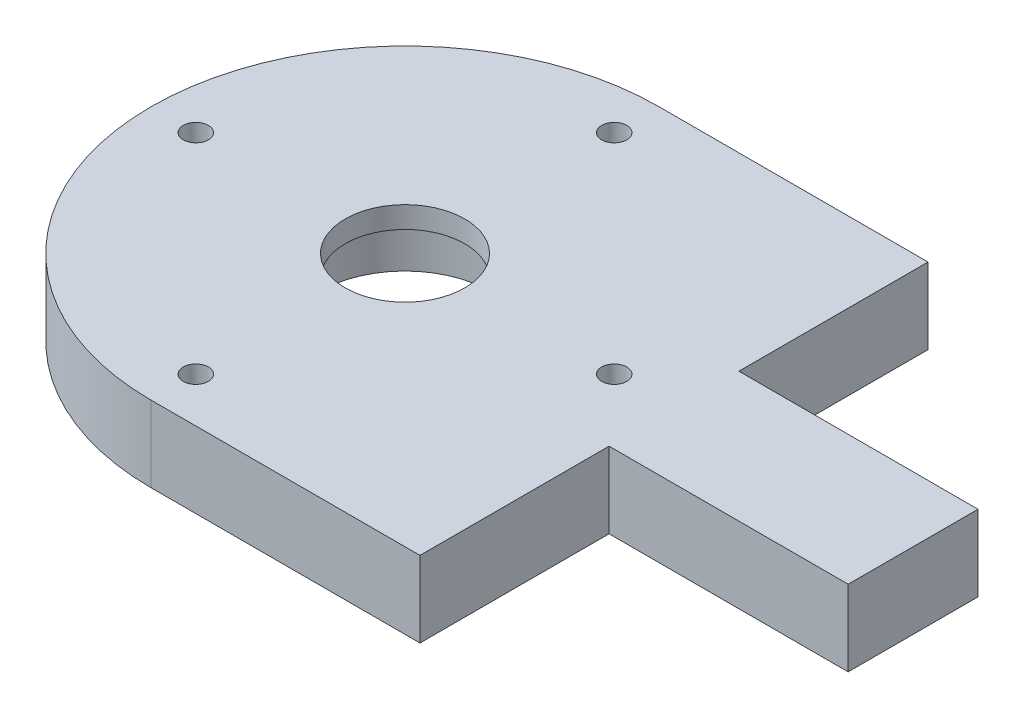
ISO-10303-21;
HEADER;
FILE_DESCRIPTION(('STEP AP214'),'2;1');
FILE_NAME('part.step','',(''),(''),'','','');
FILE_SCHEMA(('AUTOMOTIVE_DESIGN { 1 0 10303 214 1 1 1 1 }'));
ENDSEC;
DATA;
#1=APPLICATION_CONTEXT('core data for automotive mechanical design processes');
#2=APPLICATION_PROTOCOL_DEFINITION('international standard','automotive_design',2000,#1);
#3=PRODUCT_CONTEXT('',#1,'mechanical');
#4=PRODUCT('Part','Part','',(#3));
#5=PRODUCT_RELATED_PRODUCT_CATEGORY('part','',(#4));
#6=PRODUCT_DEFINITION_FORMATION('','',#4);
#7=PRODUCT_DEFINITION_CONTEXT('part definition',#1,'design');
#8=PRODUCT_DEFINITION('design','',#6,#7);
#9=PRODUCT_DEFINITION_SHAPE('','',#8);
#10=(LENGTH_UNIT() NAMED_UNIT(*) SI_UNIT(.MILLI.,.METRE.));
#11=(NAMED_UNIT(*) PLANE_ANGLE_UNIT() SI_UNIT($,.RADIAN.));
#12=(NAMED_UNIT(*) SI_UNIT($,.STERADIAN.) SOLID_ANGLE_UNIT());
#13=UNCERTAINTY_MEASURE_WITH_UNIT(LENGTH_MEASURE(1.E-05),#10,'distance_accuracy_value','');
#14=(GEOMETRIC_REPRESENTATION_CONTEXT(3) GLOBAL_UNCERTAINTY_ASSIGNED_CONTEXT((#13)) GLOBAL_UNIT_ASSIGNED_CONTEXT((#10,
#11,#12)) REPRESENTATION_CONTEXT('',''));
#15=CARTESIAN_POINT('',(0.,0.,0.));
#16=DIRECTION('',(0.,0.,1.));
#17=DIRECTION('',(1.,0.,0.));
#18=AXIS2_PLACEMENT_3D('',#15,#16,#17);
#19=CARTESIAN_POINT('',(0.,-12.7,0.));
#20=DIRECTION('',(0.,1.,0.));
#21=DIRECTION('',(0.,0.,1.));
#22=AXIS2_PLACEMENT_3D('',#19,#20,#21);
#23=PLANE('',#22);
#24=CARTESIAN_POINT('',(-137.9,-12.7,35.));
#25=DIRECTION('',(0.,1.,0.));
#26=DIRECTION('',(0.,0.,1.));
#27=AXIS2_PLACEMENT_3D('',#24,#25,#26);
#28=CIRCLE('',#27,4.05);
#29=CARTESIAN_POINT('',(-137.9,-12.7,30.95));
#30=VERTEX_POINT('',#29);
#31=CARTESIAN_POINT('',(-137.9,-12.7,39.05));
#32=VERTEX_POINT('',#31);
#33=EDGE_CURVE('E292',#30,#32,#28,.T.);
#34=ORIENTED_EDGE('',*,*,#33,.T.);
#35=DIRECTION('',(1.,0.,0.));
#36=VECTOR('',#35,1.);
#37=CARTESIAN_POINT('',(0.,-12.7,39.05));
#38=LINE('',#37,#36);
#39=CARTESIAN_POINT('',(-127.9,-12.7,39.05));
#40=VERTEX_POINT('',#39);
#41=EDGE_CURVE('E295',#32,#40,#38,.T.);
#42=ORIENTED_EDGE('',*,*,#41,.T.);
#43=CARTESIAN_POINT('',(-127.9,-12.7,35.));
#44=DIRECTION('',(0.,1.,0.));
#45=DIRECTION('',(0.,0.,1.));
#46=AXIS2_PLACEMENT_3D('',#43,#44,#45);
#47=CIRCLE('',#46,4.05);
#48=CARTESIAN_POINT('',(-127.9,-12.7,30.95));
#49=VERTEX_POINT('',#48);
#50=EDGE_CURVE('E299',#40,#49,#47,.T.);
#51=ORIENTED_EDGE('',*,*,#50,.T.);
#52=DIRECTION('',(-1.,0.,0.));
#53=VECTOR('',#52,1.);
#54=CARTESIAN_POINT('',(0.,-12.7,30.95));
#55=LINE('',#54,#53);
#56=EDGE_CURVE('E285',#49,#30,#55,.T.);
#57=ORIENTED_EDGE('',*,*,#56,.T.);
#58=EDGE_LOOP('',(#34,#42,#51,#57));
#59=FACE_BOUND('',#58,.T.);
#60=CARTESIAN_POINT('',(-137.9,-12.7,-35.));
#61=DIRECTION('',(0.,1.,0.));
#62=DIRECTION('',(0.,0.,1.));
#63=AXIS2_PLACEMENT_3D('',#60,#61,#62);
#64=CIRCLE('',#63,4.05);
#65=CARTESIAN_POINT('',(-137.9,-12.7,-39.05));
#66=VERTEX_POINT('',#65);
#67=CARTESIAN_POINT('',(-137.9,-12.7,-30.95));
#68=VERTEX_POINT('',#67);
#69=EDGE_CURVE('E251',#66,#68,#64,.T.);
#70=ORIENTED_EDGE('',*,*,#69,.T.);
#71=DIRECTION('',(1.,0.,0.));
#72=VECTOR('',#71,1.);
#73=CARTESIAN_POINT('',(0.,-12.7,-30.95));
#74=LINE('',#73,#72);
#75=CARTESIAN_POINT('',(-127.9,-12.7,-30.95));
#76=VERTEX_POINT('',#75);
#77=EDGE_CURVE('E356',#68,#76,#74,.T.);
#78=ORIENTED_EDGE('',*,*,#77,.T.);
#79=CARTESIAN_POINT('',(-127.9,-12.7,-35.));
#80=DIRECTION('',(0.,1.,0.));
#81=DIRECTION('',(0.,0.,1.));
#82=AXIS2_PLACEMENT_3D('',#79,#80,#81);
#83=CIRCLE('',#82,4.05);
#84=CARTESIAN_POINT('',(-127.9,-12.7,-39.05));
#85=VERTEX_POINT('',#84);
#86=EDGE_CURVE('E359',#76,#85,#83,.T.);
#87=ORIENTED_EDGE('',*,*,#86,.T.);
#88=DIRECTION('',(-1.,0.,0.));
#89=VECTOR('',#88,1.);
#90=CARTESIAN_POINT('',(0.,-12.7,-39.05));
#91=LINE('',#90,#89);
#92=EDGE_CURVE('E347',#85,#66,#91,.T.);
#93=ORIENTED_EDGE('',*,*,#92,.T.);
#94=EDGE_LOOP('',(#70,#78,#87,#93));
#95=FACE_BOUND('',#94,.T.);
#96=CARTESIAN_POINT('',(-137.9,-12.7,0.));
#97=DIRECTION('',(0.,1.,0.));
#98=DIRECTION('',(0.,0.,1.));
#99=AXIS2_PLACEMENT_3D('',#96,#97,#98);
#100=CIRCLE('',#99,14.35);
#101=CARTESIAN_POINT('',(-137.9,-12.7,14.35));
#102=VERTEX_POINT('',#101);
#103=EDGE_CURVE('E376',#102,#102,#100,.T.);
#104=ORIENTED_EDGE('',*,*,#103,.T.);
#105=EDGE_LOOP('',(#104));
#106=FACE_BOUND('',#105,.T.);
#107=DIRECTION('',(-1.,0.,0.));
#108=VECTOR('',#107,1.);
#109=CARTESIAN_POINT('',(0.,-12.7,10.8605569178145));
#110=LINE('',#109,#108);
#111=CARTESIAN_POINT('',(-52.9,-12.7,10.8605569178145));
#112=VERTEX_POINT('',#111);
#113=CARTESIAN_POINT('',(-92.9,-12.7,10.8605569178145));
#114=VERTEX_POINT('',#113);
#115=EDGE_CURVE('E243',#112,#114,#110,.T.);
#116=ORIENTED_EDGE('',*,*,#115,.T.);
#117=DIRECTION('',(0.,0.,1.));
#118=VECTOR('',#117,1.);
#119=CARTESIAN_POINT('',(-92.9,-12.7,0.));
#120=LINE('',#119,#118);
#121=CARTESIAN_POINT('',(-92.9,-12.7,42.5));
#122=VERTEX_POINT('',#121);
#123=EDGE_CURVE('E248',#114,#122,#120,.T.);
#124=ORIENTED_EDGE('',*,*,#123,.T.);
#125=DIRECTION('',(1.,0.,0.));
#126=VECTOR('',#125,1.);
#127=CARTESIAN_POINT('',(0.,-12.7,42.5));
#128=LINE('',#127,#126);
#129=CARTESIAN_POINT('',(-137.9,-12.7,42.5));
#130=VERTEX_POINT('',#129);
#131=EDGE_CURVE('E382',#130,#122,#128,.T.);
#132=ORIENTED_EDGE('',*,*,#131,.F.);
#133=CARTESIAN_POINT('',(-137.9,-12.7,0.));
#134=DIRECTION('',(0.,1.,0.));
#135=DIRECTION('',(0.,0.,1.));
#136=AXIS2_PLACEMENT_3D('',#133,#134,#135);
#137=CIRCLE('',#136,42.5);
#138=CARTESIAN_POINT('',(-137.9,-12.7,-42.5));
#139=VERTEX_POINT('',#138);
#140=EDGE_CURVE('E379',#139,#130,#137,.T.);
#141=ORIENTED_EDGE('',*,*,#140,.F.);
#142=DIRECTION('',(1.,0.,0.));
#143=VECTOR('',#142,1.);
#144=CARTESIAN_POINT('',(0.,-12.7,-42.5));
#145=LINE('',#144,#143);
#146=CARTESIAN_POINT('',(-92.9,-12.7,-42.5));
#147=VERTEX_POINT('',#146);
#148=EDGE_CURVE('E386',#139,#147,#145,.T.);
#149=ORIENTED_EDGE('',*,*,#148,.T.);
#150=DIRECTION('',(0.,0.,1.));
#151=VECTOR('',#150,1.);
#152=CARTESIAN_POINT('',(-92.9,-12.7,0.));
#153=LINE('',#152,#151);
#154=CARTESIAN_POINT('',(-92.9,-12.7,-10.8605569178145));
#155=VERTEX_POINT('',#154);
#156=EDGE_CURVE('E237',#147,#155,#153,.T.);
#157=ORIENTED_EDGE('',*,*,#156,.T.);
#158=DIRECTION('',(1.,0.,0.));
#159=VECTOR('',#158,1.);
#160=CARTESIAN_POINT('',(0.,-12.7,-10.8605569178145));
#161=LINE('',#160,#159);
#162=CARTESIAN_POINT('',(-52.9,-12.7,-10.8605569178145));
#163=VERTEX_POINT('',#162);
#164=EDGE_CURVE('E207',#155,#163,#161,.T.);
#165=ORIENTED_EDGE('',*,*,#164,.T.);
#166=DIRECTION('',(0.,0.,1.));
#167=VECTOR('',#166,1.);
#168=CARTESIAN_POINT('',(-52.9,-12.7,0.));
#169=LINE('',#168,#167);
#170=EDGE_CURVE('E240',#163,#112,#169,.T.);
#171=ORIENTED_EDGE('',*,*,#170,.T.);
#172=EDGE_LOOP('',(#116,#124,#132,#141,#149,#157,#165,#171));
#173=FACE_BOUND('',#172,.T.);
#174=CARTESIAN_POINT('',(-92.9,-12.7,0.));
#175=DIRECTION('',(0.,1.,0.));
#176=DIRECTION('',(0.,0.,1.));
#177=AXIS2_PLACEMENT_3D('',#174,#175,#176);
#178=CIRCLE('',#177,4.05);
#179=CARTESIAN_POINT('',(-92.9,-12.7,4.05));
#180=VERTEX_POINT('',#179);
#181=CARTESIAN_POINT('',(-92.9,-12.7,-4.05));
#182=VERTEX_POINT('',#181);
#183=EDGE_CURVE('E323',#180,#182,#178,.T.);
#184=ORIENTED_EDGE('',*,*,#183,.T.);
#185=DIRECTION('',(-1.,0.,0.));
#186=VECTOR('',#185,1.);
#187=CARTESIAN_POINT('',(0.,-12.7,-4.05));
#188=LINE('',#187,#186);
#189=CARTESIAN_POINT('',(-102.9,-12.7,-4.05));
#190=VERTEX_POINT('',#189);
#191=EDGE_CURVE('E326',#182,#190,#188,.T.);
#192=ORIENTED_EDGE('',*,*,#191,.T.);
#193=CARTESIAN_POINT('',(-102.9,-12.7,0.));
#194=DIRECTION('',(0.,1.,0.));
#195=DIRECTION('',(0.,0.,1.));
#196=AXIS2_PLACEMENT_3D('',#193,#194,#195);
#197=CIRCLE('',#196,4.05);
#198=CARTESIAN_POINT('',(-102.9,-12.7,4.05));
#199=VERTEX_POINT('',#198);
#200=EDGE_CURVE('E330',#190,#199,#197,.T.);
#201=ORIENTED_EDGE('',*,*,#200,.T.);
#202=DIRECTION('',(1.,0.,0.));
#203=VECTOR('',#202,1.);
#204=CARTESIAN_POINT('',(0.,-12.7,4.04999999999998));
#205=LINE('',#204,#203);
#206=EDGE_CURVE('E316',#199,#180,#205,.T.);
#207=ORIENTED_EDGE('',*,*,#206,.T.);
#208=EDGE_LOOP('',(#184,#192,#201,#207));
#209=FACE_BOUND('',#208,.T.);
#210=CARTESIAN_POINT('',(-162.9,-12.7,0.));
#211=DIRECTION('',(0.,1.,0.));
#212=DIRECTION('',(0.,0.,1.));
#213=AXIS2_PLACEMENT_3D('',#210,#211,#212);
#214=CIRCLE('',#213,4.05000000000001);
#215=CARTESIAN_POINT('',(-162.9,-12.7,4.05000000000001));
#216=VERTEX_POINT('',#215);
#217=CARTESIAN_POINT('',(-162.9,-12.7,-4.05000000000001));
#218=VERTEX_POINT('',#217);
#219=EDGE_CURVE('E60',#216,#218,#214,.T.);
#220=ORIENTED_EDGE('',*,*,#219,.T.);
#221=DIRECTION('',(-1.,0.,0.));
#222=VECTOR('',#221,1.);
#223=CARTESIAN_POINT('',(0.,-12.7,-4.05000000000002));
#224=LINE('',#223,#222);
#225=CARTESIAN_POINT('',(-172.9,-12.7,-4.05000000000001));
#226=VERTEX_POINT('',#225);
#227=EDGE_CURVE('E264',#218,#226,#224,.T.);
#228=ORIENTED_EDGE('',*,*,#227,.T.);
#229=CARTESIAN_POINT('',(-172.9,-12.7,0.));
#230=DIRECTION('',(0.,1.,0.));
#231=DIRECTION('',(0.,0.,1.));
#232=AXIS2_PLACEMENT_3D('',#229,#230,#231);
#233=CIRCLE('',#232,4.05000000000001);
#234=CARTESIAN_POINT('',(-172.9,-12.7,4.05000000000001));
#235=VERTEX_POINT('',#234);
#236=EDGE_CURVE('E268',#226,#235,#233,.T.);
#237=ORIENTED_EDGE('',*,*,#236,.T.);
#238=DIRECTION('',(1.,0.,0.));
#239=VECTOR('',#238,1.);
#240=CARTESIAN_POINT('',(0.,-12.7,4.05000000000002));
#241=LINE('',#240,#239);
#242=EDGE_CURVE('E256',#235,#216,#241,.T.);
#243=ORIENTED_EDGE('',*,*,#242,.T.);
#244=EDGE_LOOP('',(#220,#228,#237,#243));
#245=FACE_BOUND('',#244,.T.);
#246=ADVANCED_FACE('F35',(#59,#95,#106,#173,#209,#245),#23,.F.);
#247=CARTESIAN_POINT('',(-137.9,-12.7,0.));
#248=DIRECTION('',(0.,1.,0.));
#249=DIRECTION('',(0.,0.,1.));
#250=AXIS2_PLACEMENT_3D('',#247,#248,#249);
#251=CYLINDRICAL_SURFACE('',#250,42.5);
#252=CARTESIAN_POINT('',(-137.9,0.,0.));
#253=DIRECTION('',(0.,1.,0.));
#254=DIRECTION('',(0.,0.,1.));
#255=AXIS2_PLACEMENT_3D('',#252,#253,#254);
#256=CIRCLE('',#255,42.5);
#257=CARTESIAN_POINT('',(-137.9,0.,-42.5));
#258=VERTEX_POINT('',#257);
#259=CARTESIAN_POINT('',(-137.9,0.,42.5));
#260=VERTEX_POINT('',#259);
#261=EDGE_CURVE('E404',#258,#260,#256,.T.);
#262=ORIENTED_EDGE('',*,*,#261,.F.);
#263=DIRECTION('',(0.,1.,0.));
#264=VECTOR('',#263,1.);
#265=CARTESIAN_POINT('',(-137.9,-12.7,-42.5));
#266=LINE('',#265,#264);
#267=EDGE_CURVE('E11',#139,#258,#266,.T.);
#268=ORIENTED_EDGE('',*,*,#267,.F.);
#269=ORIENTED_EDGE('',*,*,#140,.T.);
#270=DIRECTION('',(0.,1.,0.));
#271=VECTOR('',#270,1.);
#272=CARTESIAN_POINT('',(-137.9,-12.7,42.5));
#273=LINE('',#272,#271);
#274=EDGE_CURVE('E44',#130,#260,#273,.T.);
#275=ORIENTED_EDGE('',*,*,#274,.T.);
#276=EDGE_LOOP('',(#262,#268,#269,#275));
#277=FACE_BOUND('',#276,.T.);
#278=ADVANCED_FACE('F447',(#277),#251,.T.);
#279=CARTESIAN_POINT('',(0.,-12.7,-42.5));
#280=DIRECTION('',(0.,0.,1.));
#281=DIRECTION('',(1.,0.,0.));
#282=AXIS2_PLACEMENT_3D('',#279,#280,#281);
#283=PLANE('',#282);
#284=DIRECTION('',(1.,0.,0.));
#285=VECTOR('',#284,1.);
#286=CARTESIAN_POINT('',(0.,0.,-42.5));
#287=LINE('',#286,#285);
#288=CARTESIAN_POINT('',(-92.9,0.,-42.5));
#289=VERTEX_POINT('',#288);
#290=EDGE_CURVE('E383',#258,#289,#287,.T.);
#291=ORIENTED_EDGE('',*,*,#290,.T.);
#292=DIRECTION('',(0.,-1.,0.));
#293=VECTOR('',#292,1.);
#294=CARTESIAN_POINT('',(-92.9,-12.7,-42.5));
#295=LINE('',#294,#293);
#296=EDGE_CURVE('E52',#289,#147,#295,.T.);
#297=ORIENTED_EDGE('',*,*,#296,.T.);
#298=ORIENTED_EDGE('',*,*,#148,.F.);
#299=ORIENTED_EDGE('',*,*,#267,.T.);
#300=EDGE_LOOP('',(#291,#297,#298,#299));
#301=FACE_BOUND('',#300,.T.);
#302=ADVANCED_FACE('F453',(#301),#283,.F.);
#303=CARTESIAN_POINT('',(0.,-12.7,42.5));
#304=DIRECTION('',(0.,0.,1.));
#305=DIRECTION('',(1.,0.,0.));
#306=AXIS2_PLACEMENT_3D('',#303,#304,#305);
#307=PLANE('',#306);
#308=DIRECTION('',(0.,-1.,0.));
#309=VECTOR('',#308,1.);
#310=CARTESIAN_POINT('',(-92.9,-12.7,42.5));
#311=LINE('',#310,#309);
#312=CARTESIAN_POINT('',(-92.9,0.,42.5));
#313=VERTEX_POINT('',#312);
#314=EDGE_CURVE('E246',#313,#122,#311,.T.);
#315=ORIENTED_EDGE('',*,*,#314,.F.);
#316=DIRECTION('',(1.,0.,0.));
#317=VECTOR('',#316,1.);
#318=CARTESIAN_POINT('',(0.,0.,42.5));
#319=LINE('',#318,#317);
#320=EDGE_CURVE('E407',#260,#313,#319,.T.);
#321=ORIENTED_EDGE('',*,*,#320,.F.);
#322=ORIENTED_EDGE('',*,*,#274,.F.);
#323=ORIENTED_EDGE('',*,*,#131,.T.);
#324=EDGE_LOOP('',(#315,#321,#322,#323));
#325=FACE_BOUND('',#324,.T.);
#326=ADVANCED_FACE('F466',(#325),#307,.T.);
#327=CARTESIAN_POINT('',(-137.9,-12.7,0.));
#328=DIRECTION('',(0.,1.,0.));
#329=DIRECTION('',(0.,0.,1.));
#330=AXIS2_PLACEMENT_3D('',#327,#328,#329);
#331=CYLINDRICAL_SURFACE('',#330,9.99999999999998);
#332=CARTESIAN_POINT('',(-137.9,-3.6,0.));
#333=DIRECTION('',(0.,1.,0.));
#334=DIRECTION('',(0.,0.,1.));
#335=AXIS2_PLACEMENT_3D('',#332,#333,#334);
#336=CIRCLE('',#335,9.99999999999998);
#337=CARTESIAN_POINT('',(-137.9,-3.6,9.99999999999998));
#338=VERTEX_POINT('',#337);
#339=EDGE_CURVE('E375',#338,#338,#336,.F.);
#340=ORIENTED_EDGE('',*,*,#339,.T.);
#341=EDGE_LOOP('',(#340));
#342=FACE_BOUND('',#341,.T.);
#343=CARTESIAN_POINT('',(-137.9,0.,0.));
#344=DIRECTION('',(0.,1.,0.));
#345=DIRECTION('',(0.,0.,1.));
#346=AXIS2_PLACEMENT_3D('',#343,#344,#345);
#347=CIRCLE('',#346,9.99999999999998);
#348=CARTESIAN_POINT('',(-137.9,0.,9.99999999999998));
#349=VERTEX_POINT('',#348);
#350=EDGE_CURVE('E401',#349,#349,#347,.T.);
#351=ORIENTED_EDGE('',*,*,#350,.T.);
#352=EDGE_LOOP('',(#351));
#353=FACE_BOUND('',#352,.T.);
#354=ADVANCED_FACE('F469',(#342,#353),#331,.F.);
#355=CARTESIAN_POINT('',(-172.9,-12.7,0.));
#356=DIRECTION('',(0.,1.,0.));
#357=DIRECTION('',(0.,0.,1.));
#358=AXIS2_PLACEMENT_3D('',#355,#356,#357);
#359=CYLINDRICAL_SURFACE('',#358,2.09999999999999);
#360=CARTESIAN_POINT('',(-172.9,-7.7,0.));
#361=DIRECTION('',(0.,1.,0.));
#362=DIRECTION('',(0.,0.,1.));
#363=AXIS2_PLACEMENT_3D('',#360,#361,#362);
#364=CIRCLE('',#363,2.09999999999999);
#365=CARTESIAN_POINT('',(-172.9,-7.7,2.09999999999999));
#366=VERTEX_POINT('',#365);
#367=EDGE_CURVE('E39',#366,#366,#364,.F.);
#368=ORIENTED_EDGE('',*,*,#367,.T.);
#369=EDGE_LOOP('',(#368));
#370=FACE_BOUND('',#369,.T.);
#371=CARTESIAN_POINT('',(-172.9,0.,0.));
#372=DIRECTION('',(0.,1.,0.));
#373=DIRECTION('',(0.,0.,1.));
#374=AXIS2_PLACEMENT_3D('',#371,#372,#373);
#375=CIRCLE('',#374,2.09999999999999);
#376=CARTESIAN_POINT('',(-172.9,0.,2.09999999999999));
#377=VERTEX_POINT('',#376);
#378=EDGE_CURVE('E398',#377,#377,#375,.T.);
#379=ORIENTED_EDGE('',*,*,#378,.T.);
#380=EDGE_LOOP('',(#379));
#381=FACE_BOUND('',#380,.T.);
#382=ADVANCED_FACE('F425',(#370,#381),#359,.F.);
#383=CARTESIAN_POINT('',(-137.9,-12.7,-35.));
#384=DIRECTION('',(0.,1.,0.));
#385=DIRECTION('',(0.,0.,1.));
#386=AXIS2_PLACEMENT_3D('',#383,#384,#385);
#387=CYLINDRICAL_SURFACE('',#386,2.10000000000002);
#388=CARTESIAN_POINT('',(-137.9,-7.7,-35.));
#389=DIRECTION('',(0.,1.,0.));
#390=DIRECTION('',(0.,0.,1.));
#391=AXIS2_PLACEMENT_3D('',#388,#389,#390);
#392=CIRCLE('',#391,2.10000000000002);
#393=CARTESIAN_POINT('',(-137.9,-7.7,-32.9));
#394=VERTEX_POINT('',#393);
#395=EDGE_CURVE('E418',#394,#394,#392,.F.);
#396=ORIENTED_EDGE('',*,*,#395,.T.);
#397=EDGE_LOOP('',(#396));
#398=FACE_BOUND('',#397,.T.);
#399=CARTESIAN_POINT('',(-137.9,0.,-35.));
#400=DIRECTION('',(0.,1.,0.));
#401=DIRECTION('',(0.,0.,1.));
#402=AXIS2_PLACEMENT_3D('',#399,#400,#401);
#403=CIRCLE('',#402,2.10000000000002);
#404=CARTESIAN_POINT('',(-137.9,0.,-32.9));
#405=VERTEX_POINT('',#404);
#406=EDGE_CURVE('E395',#405,#405,#403,.T.);
#407=ORIENTED_EDGE('',*,*,#406,.T.);
#408=EDGE_LOOP('',(#407));
#409=FACE_BOUND('',#408,.T.);
#410=ADVANCED_FACE('F477',(#398,#409),#387,.F.);
#411=CARTESIAN_POINT('',(-102.9,-12.7,0.));
#412=DIRECTION('',(0.,1.,0.));
#413=DIRECTION('',(0.,0.,1.));
#414=AXIS2_PLACEMENT_3D('',#411,#412,#413);
#415=CYLINDRICAL_SURFACE('',#414,2.1);
#416=CARTESIAN_POINT('',(-102.9,-7.7,0.));
#417=DIRECTION('',(0.,1.,0.));
#418=DIRECTION('',(0.,0.,1.));
#419=AXIS2_PLACEMENT_3D('',#416,#417,#418);
#420=CIRCLE('',#419,2.1);
#421=CARTESIAN_POINT('',(-102.9,-7.7,2.1));
#422=VERTEX_POINT('',#421);
#423=EDGE_CURVE('E416',#422,#422,#420,.F.);
#424=ORIENTED_EDGE('',*,*,#423,.T.);
#425=EDGE_LOOP('',(#424));
#426=FACE_BOUND('',#425,.T.);
#427=CARTESIAN_POINT('',(-102.9,0.,0.));
#428=DIRECTION('',(0.,1.,0.));
#429=DIRECTION('',(0.,0.,1.));
#430=AXIS2_PLACEMENT_3D('',#427,#428,#429);
#431=CIRCLE('',#430,2.1);
#432=CARTESIAN_POINT('',(-102.9,0.,2.1));
#433=VERTEX_POINT('',#432);
#434=EDGE_CURVE('E392',#433,#433,#431,.T.);
#435=ORIENTED_EDGE('',*,*,#434,.T.);
#436=EDGE_LOOP('',(#435));
#437=FACE_BOUND('',#436,.T.);
#438=ADVANCED_FACE('F479',(#426,#437),#415,.F.);
#439=CARTESIAN_POINT('',(-137.9,-12.7,35.));
#440=DIRECTION('',(0.,1.,0.));
#441=DIRECTION('',(0.,0.,1.));
#442=AXIS2_PLACEMENT_3D('',#439,#440,#441);
#443=CYLINDRICAL_SURFACE('',#442,2.10000000000002);
#444=CARTESIAN_POINT('',(-137.9,-7.7,35.));
#445=DIRECTION('',(0.,1.,0.));
#446=DIRECTION('',(0.,0.,1.));
#447=AXIS2_PLACEMENT_3D('',#444,#445,#446);
#448=CIRCLE('',#447,2.10000000000002);
#449=CARTESIAN_POINT('',(-137.9,-7.7,37.1));
#450=VERTEX_POINT('',#449);
#451=EDGE_CURVE('E280',#450,#450,#448,.F.);
#452=ORIENTED_EDGE('',*,*,#451,.T.);
#453=EDGE_LOOP('',(#452));
#454=FACE_BOUND('',#453,.T.);
#455=CARTESIAN_POINT('',(-137.9,0.,35.));
#456=DIRECTION('',(0.,1.,0.));
#457=DIRECTION('',(0.,0.,1.));
#458=AXIS2_PLACEMENT_3D('',#455,#456,#457);
#459=CIRCLE('',#458,2.10000000000002);
#460=CARTESIAN_POINT('',(-137.9,0.,37.1));
#461=VERTEX_POINT('',#460);
#462=EDGE_CURVE('E389',#461,#461,#459,.T.);
#463=ORIENTED_EDGE('',*,*,#462,.T.);
#464=EDGE_LOOP('',(#463));
#465=FACE_BOUND('',#464,.T.);
#466=ADVANCED_FACE('F37',(#454,#465),#443,.F.);
#467=CARTESIAN_POINT('',(0.,0.,0.));
#468=DIRECTION('',(0.,1.,0.));
#469=DIRECTION('',(0.,0.,1.));
#470=AXIS2_PLACEMENT_3D('',#467,#468,#469);
#471=PLANE('',#470);
#472=DIRECTION('',(0.,0.,1.));
#473=VECTOR('',#472,1.);
#474=CARTESIAN_POINT('',(-92.9,0.,10.8605569178145));
#475=LINE('',#474,#473);
#476=CARTESIAN_POINT('',(-92.9,0.,10.8605569178145));
#477=VERTEX_POINT('',#476);
#478=EDGE_CURVE('E210',#477,#313,#475,.T.);
#479=ORIENTED_EDGE('',*,*,#478,.F.);
#480=DIRECTION('',(-1.,0.,0.));
#481=VECTOR('',#480,1.);
#482=CARTESIAN_POINT('',(-52.9,0.,10.8605569178145));
#483=LINE('',#482,#481);
#484=CARTESIAN_POINT('',(-52.9,0.,10.8605569178145));
#485=VERTEX_POINT('',#484);
#486=EDGE_CURVE('E225',#485,#477,#483,.T.);
#487=ORIENTED_EDGE('',*,*,#486,.F.);
#488=DIRECTION('',(0.,0.,1.));
#489=VECTOR('',#488,1.);
#490=CARTESIAN_POINT('',(-52.9,0.,-10.8605569178145));
#491=LINE('',#490,#489);
#492=CARTESIAN_POINT('',(-52.9,0.,-10.8605569178145));
#493=VERTEX_POINT('',#492);
#494=EDGE_CURVE('E223',#493,#485,#491,.T.);
#495=ORIENTED_EDGE('',*,*,#494,.F.);
#496=DIRECTION('',(1.,0.,0.));
#497=VECTOR('',#496,1.);
#498=CARTESIAN_POINT('',(-92.9,0.,-10.8605569178145));
#499=LINE('',#498,#497);
#500=CARTESIAN_POINT('',(-92.9,0.,-10.8605569178145));
#501=VERTEX_POINT('',#500);
#502=EDGE_CURVE('E204',#501,#493,#499,.T.);
#503=ORIENTED_EDGE('',*,*,#502,.F.);
#504=DIRECTION('',(0.,0.,1.));
#505=VECTOR('',#504,1.);
#506=CARTESIAN_POINT('',(-92.9,0.,-58.1666365694492));
#507=LINE('',#506,#505);
#508=EDGE_CURVE('E212',#289,#501,#507,.T.);
#509=ORIENTED_EDGE('',*,*,#508,.F.);
#510=ORIENTED_EDGE('',*,*,#290,.F.);
#511=ORIENTED_EDGE('',*,*,#261,.T.);
#512=ORIENTED_EDGE('',*,*,#320,.T.);
#513=EDGE_LOOP('',(#479,#487,#495,#503,#509,#510,#511,#512));
#514=FACE_BOUND('',#513,.T.);
#515=ORIENTED_EDGE('',*,*,#462,.F.);
#516=EDGE_LOOP('',(#515));
#517=FACE_BOUND('',#516,.T.);
#518=ORIENTED_EDGE('',*,*,#434,.F.);
#519=EDGE_LOOP('',(#518));
#520=FACE_BOUND('',#519,.T.);
#521=ORIENTED_EDGE('',*,*,#406,.F.);
#522=EDGE_LOOP('',(#521));
#523=FACE_BOUND('',#522,.T.);
#524=ORIENTED_EDGE('',*,*,#378,.F.);
#525=EDGE_LOOP('',(#524));
#526=FACE_BOUND('',#525,.T.);
#527=ORIENTED_EDGE('',*,*,#350,.F.);
#528=EDGE_LOOP('',(#527));
#529=FACE_BOUND('',#528,.T.);
#530=ADVANCED_FACE('F219',(#514,#517,#520,#523,#526,#529),#471,.T.);
#531=CARTESIAN_POINT('',(-137.9,-3.6,0.));
#532=DIRECTION('',(0.,1.,0.));
#533=DIRECTION('',(0.,0.,1.));
#534=AXIS2_PLACEMENT_3D('',#531,#532,#533);
#535=PLANE('',#534);
#536=CARTESIAN_POINT('',(-137.9,-3.6,0.));
#537=DIRECTION('',(0.,1.,0.));
#538=DIRECTION('',(0.,0.,1.));
#539=AXIS2_PLACEMENT_3D('',#536,#537,#538);
#540=CIRCLE('',#539,14.35);
#541=CARTESIAN_POINT('',(-137.9,-3.6,14.35));
#542=VERTEX_POINT('',#541);
#543=EDGE_CURVE('E372',#542,#542,#540,.T.);
#544=ORIENTED_EDGE('',*,*,#543,.F.);
#545=EDGE_LOOP('',(#544));
#546=FACE_BOUND('',#545,.T.);
#547=ORIENTED_EDGE('',*,*,#339,.F.);
#548=EDGE_LOOP('',(#547));
#549=FACE_BOUND('',#548,.T.);
#550=ADVANCED_FACE('F463',(#546,#549),#535,.F.);
#551=CARTESIAN_POINT('',(-137.9,-3.6,0.));
#552=DIRECTION('',(0.,-1.,0.));
#553=DIRECTION('',(0.,0.,-1.));
#554=AXIS2_PLACEMENT_3D('',#551,#552,#553);
#555=CYLINDRICAL_SURFACE('',#554,14.35);
#556=ORIENTED_EDGE('',*,*,#543,.T.);
#557=EDGE_LOOP('',(#556));
#558=FACE_BOUND('',#557,.T.);
#559=ORIENTED_EDGE('',*,*,#103,.F.);
#560=EDGE_LOOP('',(#559));
#561=FACE_BOUND('',#560,.T.);
#562=ADVANCED_FACE('F459',(#558,#561),#555,.F.);
#563=CARTESIAN_POINT('',(-137.9,-7.7,-35.));
#564=DIRECTION('',(0.,1.,0.));
#565=DIRECTION('',(0.,0.,1.));
#566=AXIS2_PLACEMENT_3D('',#563,#564,#565);
#567=PLANE('',#566);
#568=CARTESIAN_POINT('',(-137.9,-7.7,-35.));
#569=DIRECTION('',(0.,1.,0.));
#570=DIRECTION('',(0.,0.,1.));
#571=AXIS2_PLACEMENT_3D('',#568,#569,#570);
#572=CIRCLE('',#571,4.05);
#573=CARTESIAN_POINT('',(-137.9,-7.7,-39.05));
#574=VERTEX_POINT('',#573);
#575=CARTESIAN_POINT('',(-137.9,-7.7,-30.95));
#576=VERTEX_POINT('',#575);
#577=EDGE_CURVE('E343',#574,#576,#572,.T.);
#578=ORIENTED_EDGE('',*,*,#577,.F.);
#579=DIRECTION('',(-1.,0.,0.));
#580=VECTOR('',#579,1.);
#581=CARTESIAN_POINT('',(0.,-7.7,-39.05));
#582=LINE('',#581,#580);
#583=CARTESIAN_POINT('',(-127.9,-7.7,-39.05));
#584=VERTEX_POINT('',#583);
#585=EDGE_CURVE('E351',#584,#574,#582,.T.);
#586=ORIENTED_EDGE('',*,*,#585,.F.);
#587=CARTESIAN_POINT('',(-127.9,-7.7,-35.));
#588=DIRECTION('',(0.,1.,0.));
#589=DIRECTION('',(0.,0.,1.));
#590=AXIS2_PLACEMENT_3D('',#587,#588,#589);
#591=CIRCLE('',#590,4.05);
#592=CARTESIAN_POINT('',(-127.9,-7.7,-30.95));
#593=VERTEX_POINT('',#592);
#594=EDGE_CURVE('E349',#593,#584,#591,.T.);
#595=ORIENTED_EDGE('',*,*,#594,.F.);
#596=DIRECTION('',(1.,0.,0.));
#597=VECTOR('',#596,1.);
#598=CARTESIAN_POINT('',(0.,-7.7,-30.95));
#599=LINE('',#598,#597);
#600=EDGE_CURVE('E346',#576,#593,#599,.T.);
#601=ORIENTED_EDGE('',*,*,#600,.F.);
#602=EDGE_LOOP('',(#578,#586,#595,#601));
#603=FACE_BOUND('',#602,.T.);
#604=ORIENTED_EDGE('',*,*,#395,.F.);
#605=EDGE_LOOP('',(#604));
#606=FACE_BOUND('',#605,.T.);
#607=ADVANCED_FACE('F532',(#603,#606),#567,.F.);
#608=CARTESIAN_POINT('',(-137.9,-7.7,-35.));
#609=DIRECTION('',(0.,-1.,0.));
#610=DIRECTION('',(0.,0.,-1.));
#611=AXIS2_PLACEMENT_3D('',#608,#609,#610);
#612=CYLINDRICAL_SURFACE('',#611,4.05);
#613=ORIENTED_EDGE('',*,*,#69,.F.);
#614=DIRECTION('',(0.,-1.,0.));
#615=VECTOR('',#614,1.);
#616=CARTESIAN_POINT('',(-137.9,-7.7,-39.05));
#617=LINE('',#616,#615);
#618=EDGE_CURVE('E353',#574,#66,#617,.T.);
#619=ORIENTED_EDGE('',*,*,#618,.F.);
#620=ORIENTED_EDGE('',*,*,#577,.T.);
#621=DIRECTION('',(0.,-1.,0.));
#622=VECTOR('',#621,1.);
#623=CARTESIAN_POINT('',(-137.9,-7.7,-30.95));
#624=LINE('',#623,#622);
#625=EDGE_CURVE('E327',#576,#68,#624,.T.);
#626=ORIENTED_EDGE('',*,*,#625,.T.);
#627=EDGE_LOOP('',(#613,#619,#620,#626));
#628=FACE_BOUND('',#627,.T.);
#629=ADVANCED_FACE('F534',(#628),#612,.F.);
#630=CARTESIAN_POINT('',(0.,-7.7,-30.95));
#631=DIRECTION('',(0.,0.,-1.));
#632=DIRECTION('',(-1.,0.,0.));
#633=AXIS2_PLACEMENT_3D('',#630,#631,#632);
#634=PLANE('',#633);
#635=ORIENTED_EDGE('',*,*,#77,.F.);
#636=ORIENTED_EDGE('',*,*,#625,.F.);
#637=ORIENTED_EDGE('',*,*,#600,.T.);
#638=DIRECTION('',(0.,-1.,0.));
#639=VECTOR('',#638,1.);
#640=CARTESIAN_POINT('',(-127.9,-7.7,-30.95));
#641=LINE('',#640,#639);
#642=EDGE_CURVE('E368',#593,#76,#641,.T.);
#643=ORIENTED_EDGE('',*,*,#642,.T.);
#644=EDGE_LOOP('',(#635,#636,#637,#643));
#645=FACE_BOUND('',#644,.T.);
#646=ADVANCED_FACE('F539',(#645),#634,.T.);
#647=CARTESIAN_POINT('',(-127.9,-7.7,-35.));
#648=DIRECTION('',(0.,-1.,0.));
#649=DIRECTION('',(0.,0.,-1.));
#650=AXIS2_PLACEMENT_3D('',#647,#648,#649);
#651=CYLINDRICAL_SURFACE('',#650,4.05);
#652=ORIENTED_EDGE('',*,*,#86,.F.);
#653=ORIENTED_EDGE('',*,*,#642,.F.);
#654=ORIENTED_EDGE('',*,*,#594,.T.);
#655=DIRECTION('',(0.,-1.,0.));
#656=VECTOR('',#655,1.);
#657=CARTESIAN_POINT('',(-127.9,-7.7,-39.05));
#658=LINE('',#657,#656);
#659=EDGE_CURVE('E366',#584,#85,#658,.T.);
#660=ORIENTED_EDGE('',*,*,#659,.T.);
#661=EDGE_LOOP('',(#652,#653,#654,#660));
#662=FACE_BOUND('',#661,.T.);
#663=ADVANCED_FACE('F512',(#662),#651,.F.);
#664=CARTESIAN_POINT('',(0.,-7.7,-39.05));
#665=DIRECTION('',(0.,0.,1.));
#666=DIRECTION('',(1.,0.,0.));
#667=AXIS2_PLACEMENT_3D('',#664,#665,#666);
#668=PLANE('',#667);
#669=ORIENTED_EDGE('',*,*,#92,.F.);
#670=ORIENTED_EDGE('',*,*,#659,.F.);
#671=ORIENTED_EDGE('',*,*,#585,.T.);
#672=ORIENTED_EDGE('',*,*,#618,.T.);
#673=EDGE_LOOP('',(#669,#670,#671,#672));
#674=FACE_BOUND('',#673,.T.);
#675=ADVANCED_FACE('F502',(#674),#668,.T.);
#676=CARTESIAN_POINT('',(-92.9,-7.7,0.));
#677=DIRECTION('',(0.,1.,0.));
#678=DIRECTION('',(0.,0.,1.));
#679=AXIS2_PLACEMENT_3D('',#676,#677,#678);
#680=PLANE('',#679);
#681=CARTESIAN_POINT('',(-92.9,-7.7,0.));
#682=DIRECTION('',(0.,1.,0.));
#683=DIRECTION('',(0.,0.,1.));
#684=AXIS2_PLACEMENT_3D('',#681,#682,#683);
#685=CIRCLE('',#684,4.05);
#686=CARTESIAN_POINT('',(-92.9,-7.7,4.05));
#687=VERTEX_POINT('',#686);
#688=CARTESIAN_POINT('',(-92.9,-7.7,-4.05));
#689=VERTEX_POINT('',#688);
#690=EDGE_CURVE('E312',#687,#689,#685,.T.);
#691=ORIENTED_EDGE('',*,*,#690,.F.);
#692=DIRECTION('',(1.,0.,0.));
#693=VECTOR('',#692,1.);
#694=CARTESIAN_POINT('',(0.,-7.7,4.04999999999998));
#695=LINE('',#694,#693);
#696=CARTESIAN_POINT('',(-102.9,-7.7,4.05));
#697=VERTEX_POINT('',#696);
#698=EDGE_CURVE('E320',#697,#687,#695,.T.);
#699=ORIENTED_EDGE('',*,*,#698,.F.);
#700=CARTESIAN_POINT('',(-102.9,-7.7,0.));
#701=DIRECTION('',(0.,1.,0.));
#702=DIRECTION('',(0.,0.,1.));
#703=AXIS2_PLACEMENT_3D('',#700,#701,#702);
#704=CIRCLE('',#703,4.05);
#705=CARTESIAN_POINT('',(-102.9,-7.7,-4.05));
#706=VERTEX_POINT('',#705);
#707=EDGE_CURVE('E318',#706,#697,#704,.T.);
#708=ORIENTED_EDGE('',*,*,#707,.F.);
#709=DIRECTION('',(-1.,0.,0.));
#710=VECTOR('',#709,1.);
#711=CARTESIAN_POINT('',(0.,-7.7,-4.05));
#712=LINE('',#711,#710);
#713=EDGE_CURVE('E315',#689,#706,#712,.T.);
#714=ORIENTED_EDGE('',*,*,#713,.F.);
#715=EDGE_LOOP('',(#691,#699,#708,#714));
#716=FACE_BOUND('',#715,.T.);
#717=ORIENTED_EDGE('',*,*,#423,.F.);
#718=EDGE_LOOP('',(#717));
#719=FACE_BOUND('',#718,.T.);
#720=ADVANCED_FACE('F499',(#716,#719),#680,.F.);
#721=CARTESIAN_POINT('',(-92.9,-7.7,0.));
#722=DIRECTION('',(0.,-1.,0.));
#723=DIRECTION('',(0.,0.,-1.));
#724=AXIS2_PLACEMENT_3D('',#721,#722,#723);
#725=CYLINDRICAL_SURFACE('',#724,4.05);
#726=ORIENTED_EDGE('',*,*,#183,.F.);
#727=DIRECTION('',(0.,-1.,0.));
#728=VECTOR('',#727,1.);
#729=CARTESIAN_POINT('',(-92.9,-7.7,4.05));
#730=LINE('',#729,#728);
#731=EDGE_CURVE('E322',#687,#180,#730,.T.);
#732=ORIENTED_EDGE('',*,*,#731,.F.);
#733=ORIENTED_EDGE('',*,*,#690,.T.);
#734=DIRECTION('',(0.,-1.,0.));
#735=VECTOR('',#734,1.);
#736=CARTESIAN_POINT('',(-92.9,-7.7,-4.05));
#737=LINE('',#736,#735);
#738=EDGE_CURVE('E296',#689,#182,#737,.T.);
#739=ORIENTED_EDGE('',*,*,#738,.T.);
#740=EDGE_LOOP('',(#726,#732,#733,#739));
#741=FACE_BOUND('',#740,.T.);
#742=ADVANCED_FACE('F501',(#741),#725,.F.);
#743=CARTESIAN_POINT('',(0.,-7.7,-4.05));
#744=DIRECTION('',(0.,0.,1.));
#745=DIRECTION('',(1.,0.,0.));
#746=AXIS2_PLACEMENT_3D('',#743,#744,#745);
#747=PLANE('',#746);
#748=ORIENTED_EDGE('',*,*,#191,.F.);
#749=ORIENTED_EDGE('',*,*,#738,.F.);
#750=ORIENTED_EDGE('',*,*,#713,.T.);
#751=DIRECTION('',(0.,-1.,0.));
#752=VECTOR('',#751,1.);
#753=CARTESIAN_POINT('',(-102.9,-7.7,-4.05));
#754=LINE('',#753,#752);
#755=EDGE_CURVE('E339',#706,#190,#754,.T.);
#756=ORIENTED_EDGE('',*,*,#755,.T.);
#757=EDGE_LOOP('',(#748,#749,#750,#756));
#758=FACE_BOUND('',#757,.T.);
#759=ADVANCED_FACE('F509',(#758),#747,.T.);
#760=CARTESIAN_POINT('',(-102.9,-7.7,0.));
#761=DIRECTION('',(0.,-1.,0.));
#762=DIRECTION('',(0.,0.,-1.));
#763=AXIS2_PLACEMENT_3D('',#760,#761,#762);
#764=CYLINDRICAL_SURFACE('',#763,4.05);
#765=ORIENTED_EDGE('',*,*,#200,.F.);
#766=ORIENTED_EDGE('',*,*,#755,.F.);
#767=ORIENTED_EDGE('',*,*,#707,.T.);
#768=DIRECTION('',(0.,-1.,0.));
#769=VECTOR('',#768,1.);
#770=CARTESIAN_POINT('',(-102.9,-7.7,4.05));
#771=LINE('',#770,#769);
#772=EDGE_CURVE('E337',#697,#199,#771,.T.);
#773=ORIENTED_EDGE('',*,*,#772,.T.);
#774=EDGE_LOOP('',(#765,#766,#767,#773));
#775=FACE_BOUND('',#774,.T.);
#776=ADVANCED_FACE('F524',(#775),#764,.F.);
#777=CARTESIAN_POINT('',(0.,-7.7,4.04999999999998));
#778=DIRECTION('',(0.,0.,-1.));
#779=DIRECTION('',(-1.,0.,0.));
#780=AXIS2_PLACEMENT_3D('',#777,#778,#779);
#781=PLANE('',#780);
#782=ORIENTED_EDGE('',*,*,#206,.F.);
#783=ORIENTED_EDGE('',*,*,#772,.F.);
#784=ORIENTED_EDGE('',*,*,#698,.T.);
#785=ORIENTED_EDGE('',*,*,#731,.T.);
#786=EDGE_LOOP('',(#782,#783,#784,#785));
#787=FACE_BOUND('',#786,.T.);
#788=ADVANCED_FACE('F520',(#787),#781,.T.);
#789=CARTESIAN_POINT('',(-137.9,-7.7,35.));
#790=DIRECTION('',(0.,1.,0.));
#791=DIRECTION('',(0.,0.,1.));
#792=AXIS2_PLACEMENT_3D('',#789,#790,#791);
#793=PLANE('',#792);
#794=CARTESIAN_POINT('',(-137.9,-7.7,35.));
#795=DIRECTION('',(0.,1.,0.));
#796=DIRECTION('',(0.,0.,1.));
#797=AXIS2_PLACEMENT_3D('',#794,#795,#796);
#798=CIRCLE('',#797,4.05);
#799=CARTESIAN_POINT('',(-137.9,-7.7,30.95));
#800=VERTEX_POINT('',#799);
#801=CARTESIAN_POINT('',(-137.9,-7.7,39.05));
#802=VERTEX_POINT('',#801);
#803=EDGE_CURVE('E281',#800,#802,#798,.T.);
#804=ORIENTED_EDGE('',*,*,#803,.F.);
#805=DIRECTION('',(-1.,0.,0.));
#806=VECTOR('',#805,1.);
#807=CARTESIAN_POINT('',(0.,-7.7,30.95));
#808=LINE('',#807,#806);
#809=CARTESIAN_POINT('',(-127.9,-7.7,30.95));
#810=VERTEX_POINT('',#809);
#811=EDGE_CURVE('E289',#810,#800,#808,.T.);
#812=ORIENTED_EDGE('',*,*,#811,.F.);
#813=CARTESIAN_POINT('',(-127.9,-7.7,35.));
#814=DIRECTION('',(0.,1.,0.));
#815=DIRECTION('',(0.,0.,1.));
#816=AXIS2_PLACEMENT_3D('',#813,#814,#815);
#817=CIRCLE('',#816,4.05);
#818=CARTESIAN_POINT('',(-127.9,-7.7,39.05));
#819=VERTEX_POINT('',#818);
#820=EDGE_CURVE('E287',#819,#810,#817,.T.);
#821=ORIENTED_EDGE('',*,*,#820,.F.);
#822=DIRECTION('',(1.,0.,0.));
#823=VECTOR('',#822,1.);
#824=CARTESIAN_POINT('',(0.,-7.7,39.05));
#825=LINE('',#824,#823);
#826=EDGE_CURVE('E284',#802,#819,#825,.T.);
#827=ORIENTED_EDGE('',*,*,#826,.F.);
#828=EDGE_LOOP('',(#804,#812,#821,#827));
#829=FACE_BOUND('',#828,.T.);
#830=ORIENTED_EDGE('',*,*,#451,.F.);
#831=EDGE_LOOP('',(#830));
#832=FACE_BOUND('',#831,.T.);
#833=ADVANCED_FACE('F523',(#829,#832),#793,.F.);
#834=CARTESIAN_POINT('',(-137.9,-7.7,35.));
#835=DIRECTION('',(0.,-1.,0.));
#836=DIRECTION('',(0.,0.,-1.));
#837=AXIS2_PLACEMENT_3D('',#834,#835,#836);
#838=CYLINDRICAL_SURFACE('',#837,4.05);
#839=ORIENTED_EDGE('',*,*,#33,.F.);
#840=DIRECTION('',(0.,-1.,0.));
#841=VECTOR('',#840,1.);
#842=CARTESIAN_POINT('',(-137.9,-7.7,30.95));
#843=LINE('',#842,#841);
#844=EDGE_CURVE('E291',#800,#30,#843,.T.);
#845=ORIENTED_EDGE('',*,*,#844,.F.);
#846=ORIENTED_EDGE('',*,*,#803,.T.);
#847=DIRECTION('',(0.,-1.,0.));
#848=VECTOR('',#847,1.);
#849=CARTESIAN_POINT('',(-137.9,-7.7,39.05));
#850=LINE('',#849,#848);
#851=EDGE_CURVE('E265',#802,#32,#850,.T.);
#852=ORIENTED_EDGE('',*,*,#851,.T.);
#853=EDGE_LOOP('',(#839,#845,#846,#852));
#854=FACE_BOUND('',#853,.T.);
#855=ADVANCED_FACE('F518',(#854),#838,.F.);
#856=CARTESIAN_POINT('',(0.,-7.7,39.05));
#857=DIRECTION('',(0.,0.,-1.));
#858=DIRECTION('',(-1.,0.,0.));
#859=AXIS2_PLACEMENT_3D('',#856,#857,#858);
#860=PLANE('',#859);
#861=ORIENTED_EDGE('',*,*,#41,.F.);
#862=ORIENTED_EDGE('',*,*,#851,.F.);
#863=ORIENTED_EDGE('',*,*,#826,.T.);
#864=DIRECTION('',(0.,-1.,0.));
#865=VECTOR('',#864,1.);
#866=CARTESIAN_POINT('',(-127.9,-7.7,39.05));
#867=LINE('',#866,#865);
#868=EDGE_CURVE('E308',#819,#40,#867,.T.);
#869=ORIENTED_EDGE('',*,*,#868,.T.);
#870=EDGE_LOOP('',(#861,#862,#863,#869));
#871=FACE_BOUND('',#870,.T.);
#872=ADVANCED_FACE('F586',(#871),#860,.T.);
#873=CARTESIAN_POINT('',(-127.9,-7.7,35.));
#874=DIRECTION('',(0.,-1.,0.));
#875=DIRECTION('',(0.,0.,-1.));
#876=AXIS2_PLACEMENT_3D('',#873,#874,#875);
#877=CYLINDRICAL_SURFACE('',#876,4.05);
#878=ORIENTED_EDGE('',*,*,#50,.F.);
#879=ORIENTED_EDGE('',*,*,#868,.F.);
#880=ORIENTED_EDGE('',*,*,#820,.T.);
#881=DIRECTION('',(0.,-1.,0.));
#882=VECTOR('',#881,1.);
#883=CARTESIAN_POINT('',(-127.9,-7.7,30.95));
#884=LINE('',#883,#882);
#885=EDGE_CURVE('E306',#810,#49,#884,.T.);
#886=ORIENTED_EDGE('',*,*,#885,.T.);
#887=EDGE_LOOP('',(#878,#879,#880,#886));
#888=FACE_BOUND('',#887,.T.);
#889=ADVANCED_FACE('F440',(#888),#877,.F.);
#890=CARTESIAN_POINT('',(0.,-7.7,30.95));
#891=DIRECTION('',(0.,0.,1.));
#892=DIRECTION('',(1.,0.,0.));
#893=AXIS2_PLACEMENT_3D('',#890,#891,#892);
#894=PLANE('',#893);
#895=ORIENTED_EDGE('',*,*,#56,.F.);
#896=ORIENTED_EDGE('',*,*,#885,.F.);
#897=ORIENTED_EDGE('',*,*,#811,.T.);
#898=ORIENTED_EDGE('',*,*,#844,.T.);
#899=EDGE_LOOP('',(#895,#896,#897,#898));
#900=FACE_BOUND('',#899,.T.);
#901=ADVANCED_FACE('F431',(#900),#894,.T.);
#902=CARTESIAN_POINT('',(-162.9,-7.7,0.));
#903=DIRECTION('',(0.,1.,0.));
#904=DIRECTION('',(0.,0.,1.));
#905=AXIS2_PLACEMENT_3D('',#902,#903,#904);
#906=PLANE('',#905);
#907=CARTESIAN_POINT('',(-162.9,-7.7,0.));
#908=DIRECTION('',(0.,1.,0.));
#909=DIRECTION('',(0.,0.,1.));
#910=AXIS2_PLACEMENT_3D('',#907,#908,#909);
#911=CIRCLE('',#910,4.05000000000001);
#912=CARTESIAN_POINT('',(-162.9,-7.7,4.05000000000001));
#913=VERTEX_POINT('',#912);
#914=CARTESIAN_POINT('',(-162.9,-7.7,-4.05000000000001));
#915=VERTEX_POINT('',#914);
#916=EDGE_CURVE('E252',#913,#915,#911,.T.);
#917=ORIENTED_EDGE('',*,*,#916,.F.);
#918=DIRECTION('',(1.,0.,0.));
#919=VECTOR('',#918,1.);
#920=CARTESIAN_POINT('',(0.,-7.7,4.05000000000002));
#921=LINE('',#920,#919);
#922=CARTESIAN_POINT('',(-172.9,-7.7,4.05000000000001));
#923=VERTEX_POINT('',#922);
#924=EDGE_CURVE('E260',#923,#913,#921,.T.);
#925=ORIENTED_EDGE('',*,*,#924,.F.);
#926=CARTESIAN_POINT('',(-172.9,-7.7,0.));
#927=DIRECTION('',(0.,1.,0.));
#928=DIRECTION('',(0.,0.,1.));
#929=AXIS2_PLACEMENT_3D('',#926,#927,#928);
#930=CIRCLE('',#929,4.05000000000001);
#931=CARTESIAN_POINT('',(-172.9,-7.7,-4.05000000000001));
#932=VERTEX_POINT('',#931);
#933=EDGE_CURVE('E258',#932,#923,#930,.T.);
#934=ORIENTED_EDGE('',*,*,#933,.F.);
#935=DIRECTION('',(-1.,0.,0.));
#936=VECTOR('',#935,1.);
#937=CARTESIAN_POINT('',(0.,-7.7,-4.05000000000002));
#938=LINE('',#937,#936);
#939=EDGE_CURVE('E255',#915,#932,#938,.T.);
#940=ORIENTED_EDGE('',*,*,#939,.F.);
#941=EDGE_LOOP('',(#917,#925,#934,#940));
#942=FACE_BOUND('',#941,.T.);
#943=ORIENTED_EDGE('',*,*,#367,.F.);
#944=EDGE_LOOP('',(#943));
#945=FACE_BOUND('',#944,.T.);
#946=ADVANCED_FACE('F428',(#942,#945),#906,.F.);
#947=CARTESIAN_POINT('',(-162.9,-7.7,0.));
#948=DIRECTION('',(0.,-1.,0.));
#949=DIRECTION('',(0.,0.,-1.));
#950=AXIS2_PLACEMENT_3D('',#947,#948,#949);
#951=CYLINDRICAL_SURFACE('',#950,4.05000000000001);
#952=ORIENTED_EDGE('',*,*,#219,.F.);
#953=DIRECTION('',(0.,-1.,0.));
#954=VECTOR('',#953,1.);
#955=CARTESIAN_POINT('',(-162.9,-7.7,4.05000000000001));
#956=LINE('',#955,#954);
#957=EDGE_CURVE('E262',#913,#216,#956,.T.);
#958=ORIENTED_EDGE('',*,*,#957,.F.);
#959=ORIENTED_EDGE('',*,*,#916,.T.);
#960=DIRECTION('',(0.,-1.,0.));
#961=VECTOR('',#960,1.);
#962=CARTESIAN_POINT('',(-162.9,-7.7,-4.05000000000001));
#963=LINE('',#962,#961);
#964=EDGE_CURVE('E278',#915,#218,#963,.T.);
#965=ORIENTED_EDGE('',*,*,#964,.T.);
#966=EDGE_LOOP('',(#952,#958,#959,#965));
#967=FACE_BOUND('',#966,.T.);
#968=ADVANCED_FACE('F430',(#967),#951,.F.);
#969=CARTESIAN_POINT('',(0.,-7.7,-4.05000000000002));
#970=DIRECTION('',(0.,0.,1.));
#971=DIRECTION('',(1.,0.,0.));
#972=AXIS2_PLACEMENT_3D('',#969,#970,#971);
#973=PLANE('',#972);
#974=ORIENTED_EDGE('',*,*,#227,.F.);
#975=ORIENTED_EDGE('',*,*,#964,.F.);
#976=ORIENTED_EDGE('',*,*,#939,.T.);
#977=DIRECTION('',(0.,-1.,0.));
#978=VECTOR('',#977,1.);
#979=CARTESIAN_POINT('',(-172.9,-7.7,-4.05000000000001));
#980=LINE('',#979,#978);
#981=EDGE_CURVE('E276',#932,#226,#980,.T.);
#982=ORIENTED_EDGE('',*,*,#981,.T.);
#983=EDGE_LOOP('',(#974,#975,#976,#982));
#984=FACE_BOUND('',#983,.T.);
#985=ADVANCED_FACE('F438',(#984),#973,.T.);
#986=CARTESIAN_POINT('',(-172.9,-7.7,0.));
#987=DIRECTION('',(0.,-1.,0.));
#988=DIRECTION('',(0.,0.,-1.));
#989=AXIS2_PLACEMENT_3D('',#986,#987,#988);
#990=CYLINDRICAL_SURFACE('',#989,4.05000000000001);
#991=ORIENTED_EDGE('',*,*,#236,.F.);
#992=ORIENTED_EDGE('',*,*,#981,.F.);
#993=ORIENTED_EDGE('',*,*,#933,.T.);
#994=DIRECTION('',(0.,-1.,0.));
#995=VECTOR('',#994,1.);
#996=CARTESIAN_POINT('',(-172.9,-7.7,4.05000000000001));
#997=LINE('',#996,#995);
#998=EDGE_CURVE('E274',#923,#235,#997,.T.);
#999=ORIENTED_EDGE('',*,*,#998,.T.);
#1000=EDGE_LOOP('',(#991,#992,#993,#999));
#1001=FACE_BOUND('',#1000,.T.);
#1002=ADVANCED_FACE('F572',(#1001),#990,.F.);
#1003=CARTESIAN_POINT('',(0.,-7.7,4.05000000000002));
#1004=DIRECTION('',(0.,0.,-1.));
#1005=DIRECTION('',(-1.,0.,0.));
#1006=AXIS2_PLACEMENT_3D('',#1003,#1004,#1005);
#1007=PLANE('',#1006);
#1008=ORIENTED_EDGE('',*,*,#242,.F.);
#1009=ORIENTED_EDGE('',*,*,#998,.F.);
#1010=ORIENTED_EDGE('',*,*,#924,.T.);
#1011=ORIENTED_EDGE('',*,*,#957,.T.);
#1012=EDGE_LOOP('',(#1008,#1009,#1010,#1011));
#1013=FACE_BOUND('',#1012,.T.);
#1014=ADVANCED_FACE('F565',(#1013),#1007,.T.);
#1015=CARTESIAN_POINT('',(-92.9,-20.,10.8605569178145));
#1016=DIRECTION('',(-1.,0.,0.));
#1017=DIRECTION('',(0.,0.,1.));
#1018=AXIS2_PLACEMENT_3D('',#1015,#1016,#1017);
#1019=PLANE('',#1018);
#1020=DIRECTION('',(0.,1.,0.));
#1021=VECTOR('',#1020,1.);
#1022=CARTESIAN_POINT('',(-92.9,-20.,10.8605569178145));
#1023=LINE('',#1022,#1021);
#1024=EDGE_CURVE('E231',#114,#477,#1023,.T.);
#1025=ORIENTED_EDGE('',*,*,#1024,.T.);
#1026=ORIENTED_EDGE('',*,*,#478,.T.);
#1027=ORIENTED_EDGE('',*,*,#314,.T.);
#1028=ORIENTED_EDGE('',*,*,#123,.F.);
#1029=EDGE_LOOP('',(#1025,#1026,#1027,#1028));
#1030=FACE_BOUND('',#1029,.T.);
#1031=ADVANCED_FACE('F579',(#1030),#1019,.F.);
#1032=CARTESIAN_POINT('',(-52.9,-20.,10.8605569178145));
#1033=DIRECTION('',(0.,0.,-1.));
#1034=DIRECTION('',(-1.,0.,0.));
#1035=AXIS2_PLACEMENT_3D('',#1032,#1033,#1034);
#1036=PLANE('',#1035);
#1037=DIRECTION('',(0.,1.,0.));
#1038=VECTOR('',#1037,1.);
#1039=CARTESIAN_POINT('',(-52.9,-20.,10.8605569178145));
#1040=LINE('',#1039,#1038);
#1041=EDGE_CURVE('E233',#112,#485,#1040,.T.);
#1042=ORIENTED_EDGE('',*,*,#1041,.T.);
#1043=ORIENTED_EDGE('',*,*,#486,.T.);
#1044=ORIENTED_EDGE('',*,*,#1024,.F.);
#1045=ORIENTED_EDGE('',*,*,#115,.F.);
#1046=EDGE_LOOP('',(#1042,#1043,#1044,#1045));
#1047=FACE_BOUND('',#1046,.T.);
#1048=ADVANCED_FACE('F736',(#1047),#1036,.F.);
#1049=CARTESIAN_POINT('',(-52.9,-20.,-10.8605569178145));
#1050=DIRECTION('',(-1.,0.,0.));
#1051=DIRECTION('',(0.,0.,1.));
#1052=AXIS2_PLACEMENT_3D('',#1049,#1050,#1051);
#1053=PLANE('',#1052);
#1054=DIRECTION('',(0.,1.,0.));
#1055=VECTOR('',#1054,1.);
#1056=CARTESIAN_POINT('',(-52.9,-20.,-10.8605569178145));
#1057=LINE('',#1056,#1055);
#1058=EDGE_CURVE('E209',#163,#493,#1057,.T.);
#1059=ORIENTED_EDGE('',*,*,#1058,.T.);
#1060=ORIENTED_EDGE('',*,*,#494,.T.);
#1061=ORIENTED_EDGE('',*,*,#1041,.F.);
#1062=ORIENTED_EDGE('',*,*,#170,.F.);
#1063=EDGE_LOOP('',(#1059,#1060,#1061,#1062));
#1064=FACE_BOUND('',#1063,.T.);
#1065=ADVANCED_FACE('F747',(#1064),#1053,.F.);
#1066=CARTESIAN_POINT('',(-92.9,-20.,-10.8605569178145));
#1067=DIRECTION('',(0.,0.,1.));
#1068=DIRECTION('',(1.,0.,0.));
#1069=AXIS2_PLACEMENT_3D('',#1066,#1067,#1068);
#1070=PLANE('',#1069);
#1071=DIRECTION('',(0.,1.,0.));
#1072=VECTOR('',#1071,1.);
#1073=CARTESIAN_POINT('',(-92.9,-20.,-10.8605569178145));
#1074=LINE('',#1073,#1072);
#1075=EDGE_CURVE('E200',#155,#501,#1074,.T.);
#1076=ORIENTED_EDGE('',*,*,#1075,.T.);
#1077=ORIENTED_EDGE('',*,*,#502,.T.);
#1078=ORIENTED_EDGE('',*,*,#1058,.F.);
#1079=ORIENTED_EDGE('',*,*,#164,.F.);
#1080=EDGE_LOOP('',(#1076,#1077,#1078,#1079));
#1081=FACE_BOUND('',#1080,.T.);
#1082=ADVANCED_FACE('F201',(#1081),#1070,.F.);
#1083=CARTESIAN_POINT('',(-92.9,-20.,-58.1666365694492));
#1084=DIRECTION('',(-1.,0.,0.));
#1085=DIRECTION('',(0.,0.,1.));
#1086=AXIS2_PLACEMENT_3D('',#1083,#1084,#1085);
#1087=PLANE('',#1086);
#1088=ORIENTED_EDGE('',*,*,#296,.F.);
#1089=ORIENTED_EDGE('',*,*,#508,.T.);
#1090=ORIENTED_EDGE('',*,*,#1075,.F.);
#1091=ORIENTED_EDGE('',*,*,#156,.F.);
#1092=EDGE_LOOP('',(#1088,#1089,#1090,#1091));
#1093=FACE_BOUND('',#1092,.T.);
#1094=ADVANCED_FACE('F213',(#1093),#1087,.F.);
#1095=CLOSED_SHELL('',(#246,#278,#302,#326,#354,#382,#410,#438,#466,#530,#550,#562,#607,#629,
#646,#663,#675,#720,#742,#759,#776,#788,#833,#855,#872,#889,#901,#946,#968,#985,#1002,#1014,
#1031,#1048,#1065,#1082,#1094));
#1096=MANIFOLD_SOLID_BREP('B2',#1095);
#1097=ADVANCED_BREP_SHAPE_REPRESENTATION('',(#18,#1096),#14);
#1098=SHAPE_DEFINITION_REPRESENTATION(#9,#1097);
ENDSEC;
END-ISO-10303-21;
